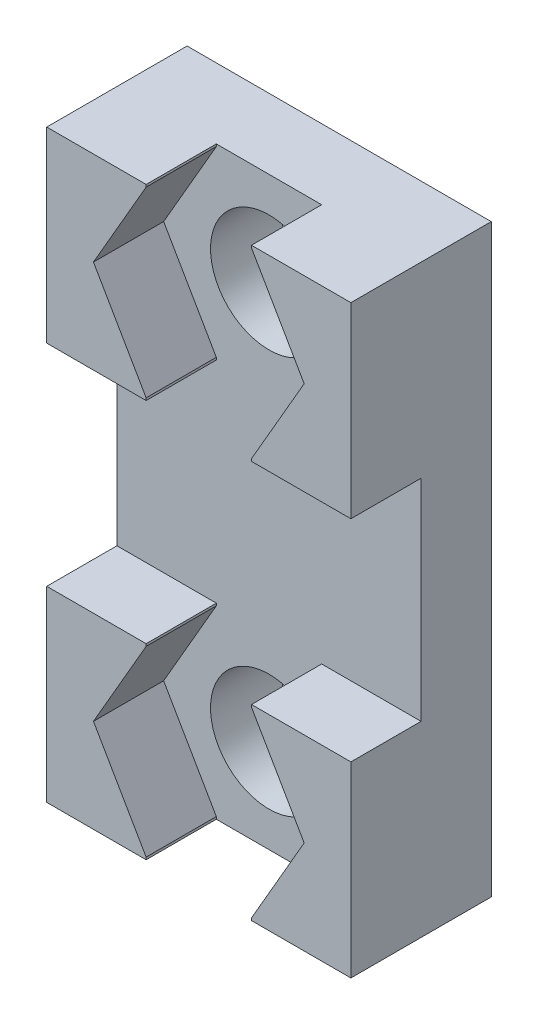
ISO-10303-21;
HEADER;
FILE_DESCRIPTION(('STEP AP214'),'2;1');
FILE_NAME('part.step','',(''),(''),'','','');
FILE_SCHEMA(('AUTOMOTIVE_DESIGN { 1 0 10303 214 1 1 1 1 }'));
ENDSEC;
DATA;
#1=APPLICATION_CONTEXT('core data for automotive mechanical design processes');
#2=APPLICATION_PROTOCOL_DEFINITION('international standard','automotive_design',2000,#1);
#3=PRODUCT_CONTEXT('',#1,'mechanical');
#4=PRODUCT('Part','Part','',(#3));
#5=PRODUCT_RELATED_PRODUCT_CATEGORY('part','',(#4));
#6=PRODUCT_DEFINITION_FORMATION('','',#4);
#7=PRODUCT_DEFINITION_CONTEXT('part definition',#1,'design');
#8=PRODUCT_DEFINITION('design','',#6,#7);
#9=PRODUCT_DEFINITION_SHAPE('','',#8);
#10=(LENGTH_UNIT() NAMED_UNIT(*) SI_UNIT(.MILLI.,.METRE.));
#11=(NAMED_UNIT(*) PLANE_ANGLE_UNIT() SI_UNIT($,.RADIAN.));
#12=(NAMED_UNIT(*) SI_UNIT($,.STERADIAN.) SOLID_ANGLE_UNIT());
#13=UNCERTAINTY_MEASURE_WITH_UNIT(LENGTH_MEASURE(1.E-05),#10,'distance_accuracy_value','');
#14=(GEOMETRIC_REPRESENTATION_CONTEXT(3) GLOBAL_UNCERTAINTY_ASSIGNED_CONTEXT((#13)) GLOBAL_UNIT_ASSIGNED_CONTEXT((#10,
#11,#12)) REPRESENTATION_CONTEXT('',''));
#15=CARTESIAN_POINT('',(0.,0.,0.));
#16=DIRECTION('',(0.,0.,1.));
#17=DIRECTION('',(1.,0.,0.));
#18=AXIS2_PLACEMENT_3D('',#15,#16,#17);
#19=CARTESIAN_POINT('',(0.,0.,1.5));
#20=DIRECTION('',(0.,0.,1.));
#21=DIRECTION('',(1.,0.,0.));
#22=AXIS2_PLACEMENT_3D('',#19,#20,#21);
#23=PLANE('',#22);
#24=CARTESIAN_POINT('',(-44.25,-13.525,1.5));
#25=DIRECTION('',(0.,0.,1.));
#26=DIRECTION('',(1.,0.,0.));
#27=AXIS2_PLACEMENT_3D('',#24,#25,#26);
#28=CIRCLE('',#27,1.25000000000001);
#29=CARTESIAN_POINT('',(-43.,-13.525,1.5));
#30=VERTEX_POINT('',#29);
#31=EDGE_CURVE('E430',#30,#30,#28,.T.);
#32=ORIENTED_EDGE('',*,*,#31,.F.);
#33=EDGE_LOOP('',(#32));
#34=FACE_BOUND('',#33,.T.);
#35=CARTESIAN_POINT('',(-44.25,-5.02500000000002,1.5));
#36=DIRECTION('',(0.,0.,1.));
#37=DIRECTION('',(1.,0.,0.));
#38=AXIS2_PLACEMENT_3D('',#35,#36,#37);
#39=CIRCLE('',#38,1.25000000000001);
#40=CARTESIAN_POINT('',(-43.,-5.02500000000002,1.5));
#41=VERTEX_POINT('',#40);
#42=EDGE_CURVE('E440',#41,#41,#39,.T.);
#43=ORIENTED_EDGE('',*,*,#42,.F.);
#44=EDGE_LOOP('',(#43));
#45=FACE_BOUND('',#44,.T.);
#46=DIRECTION('',(1.,0.,0.));
#47=VECTOR('',#46,1.);
#48=CARTESIAN_POINT('',(0.,-15.525,1.5));
#49=LINE('',#48,#47);
#50=CARTESIAN_POINT('',(-45.3758330249198,-15.525,1.5));
#51=VERTEX_POINT('',#50);
#52=CARTESIAN_POINT('',(-43.1241669750802,-15.525,1.5));
#53=VERTEX_POINT('',#52);
#54=EDGE_CURVE('E429',#51,#53,#49,.T.);
#55=ORIENTED_EDGE('',*,*,#54,.T.);
#56=DIRECTION('',(0.,-1.,0.));
#57=VECTOR('',#56,1.);
#58=CARTESIAN_POINT('',(-43.1241669750802,0.,1.5));
#59=LINE('',#58,#57);
#60=CARTESIAN_POINT('',(-43.1241669750802,-15.475,1.5));
#61=VERTEX_POINT('',#60);
#62=EDGE_CURVE('E51',#61,#53,#59,.T.);
#63=ORIENTED_EDGE('',*,*,#62,.F.);
#64=DIRECTION('',(0.499999999999999,0.866025403784439,0.));
#65=VECTOR('',#64,1.);
#66=CARTESIAN_POINT('',(-25.6422536695281,14.8045620587307,1.5));
#67=LINE('',#66,#65);
#68=CARTESIAN_POINT('',(-41.9983339501605,-13.525,1.5));
#69=VERTEX_POINT('',#68);
#70=EDGE_CURVE('E228',#61,#69,#67,.T.);
#71=ORIENTED_EDGE('',*,*,#70,.T.);
#72=DIRECTION('',(-0.499999999999999,0.866025403784439,0.));
#73=VECTOR('',#72,1.);
#74=CARTESIAN_POINT('',(-37.3552472557127,-21.5670620587307,1.5));
#75=LINE('',#74,#73);
#76=CARTESIAN_POINT('',(-43.1241669750802,-11.575,1.5));
#77=VERTEX_POINT('',#76);
#78=EDGE_CURVE('E246',#69,#77,#75,.T.);
#79=ORIENTED_EDGE('',*,*,#78,.T.);
#80=DIRECTION('',(0.,1.,0.));
#81=VECTOR('',#80,1.);
#82=CARTESIAN_POINT('',(-43.1241669750802,0.,1.5));
#83=LINE('',#82,#81);
#84=CARTESIAN_POINT('',(-43.1241669750802,-11.525,1.5));
#85=VERTEX_POINT('',#84);
#86=EDGE_CURVE('E58',#77,#85,#83,.T.);
#87=ORIENTED_EDGE('',*,*,#86,.T.);
#88=DIRECTION('',(-1.,0.,0.));
#89=VECTOR('',#88,1.);
#90=CARTESIAN_POINT('',(0.,-11.525,1.5));
#91=LINE('',#90,#89);
#92=CARTESIAN_POINT('',(-41.,-11.525,1.5));
#93=VERTEX_POINT('',#92);
#94=EDGE_CURVE('E262',#93,#85,#91,.T.);
#95=ORIENTED_EDGE('',*,*,#94,.F.);
#96=DIRECTION('',(0.,1.,0.));
#97=VECTOR('',#96,1.);
#98=CARTESIAN_POINT('',(-41.,0.,1.5));
#99=LINE('',#98,#97);
#100=CARTESIAN_POINT('',(-41.,-7.02500000000002,1.5));
#101=VERTEX_POINT('',#100);
#102=EDGE_CURVE('E437',#93,#101,#99,.T.);
#103=ORIENTED_EDGE('',*,*,#102,.T.);
#104=DIRECTION('',(-1.,0.,0.));
#105=VECTOR('',#104,1.);
#106=CARTESIAN_POINT('',(0.,-7.02500000000002,1.5));
#107=LINE('',#106,#105);
#108=CARTESIAN_POINT('',(-43.1241669750802,-7.02500000000002,1.5));
#109=VERTEX_POINT('',#108);
#110=EDGE_CURVE('E329',#101,#109,#107,.T.);
#111=ORIENTED_EDGE('',*,*,#110,.T.);
#112=DIRECTION('',(0.,-1.,0.));
#113=VECTOR('',#112,1.);
#114=CARTESIAN_POINT('',(-43.1241669750802,0.,1.5));
#115=LINE('',#114,#113);
#116=CARTESIAN_POINT('',(-43.1241669750802,-6.97500000000002,1.5));
#117=VERTEX_POINT('',#116);
#118=EDGE_CURVE('E352',#117,#109,#115,.T.);
#119=ORIENTED_EDGE('',*,*,#118,.F.);
#120=DIRECTION('',(-0.499999999999999,-0.866025403784439,0.));
#121=VECTOR('',#120,1.);
#122=CARTESIAN_POINT('',(-29.322861635612,16.9295620587307,1.5));
#123=LINE('',#122,#121);
#124=CARTESIAN_POINT('',(-41.9983339501605,-5.02500000000002,1.5));
#125=VERTEX_POINT('',#124);
#126=EDGE_CURVE('E349',#125,#117,#123,.T.);
#127=ORIENTED_EDGE('',*,*,#126,.F.);
#128=DIRECTION('',(0.499999999999999,-0.866025403784439,0.));
#129=VECTOR('',#128,1.);
#130=CARTESIAN_POINT('',(-33.6746392896288,-19.4420620587307,1.5));
#131=LINE('',#130,#129);
#132=CARTESIAN_POINT('',(-43.1241669750802,-3.07500000000002,1.5));
#133=VERTEX_POINT('',#132);
#134=EDGE_CURVE('E346',#133,#125,#131,.T.);
#135=ORIENTED_EDGE('',*,*,#134,.F.);
#136=DIRECTION('',(0.,1.,0.));
#137=VECTOR('',#136,1.);
#138=CARTESIAN_POINT('',(-43.1241669750802,0.,1.5));
#139=LINE('',#138,#137);
#140=CARTESIAN_POINT('',(-43.1241669750802,-3.02500000000002,1.5));
#141=VERTEX_POINT('',#140);
#142=EDGE_CURVE('E324',#133,#141,#139,.T.);
#143=ORIENTED_EDGE('',*,*,#142,.T.);
#144=DIRECTION('',(-1.,0.,0.));
#145=VECTOR('',#144,1.);
#146=CARTESIAN_POINT('',(0.,-3.02500000000002,1.5));
#147=LINE('',#146,#145);
#148=CARTESIAN_POINT('',(-45.3758330249198,-3.02500000000002,1.5));
#149=VERTEX_POINT('',#148);
#150=EDGE_CURVE('E37',#141,#149,#147,.T.);
#151=ORIENTED_EDGE('',*,*,#150,.T.);
#152=DIRECTION('',(0.,1.,0.));
#153=VECTOR('',#152,1.);
#154=CARTESIAN_POINT('',(-45.3758330249198,0.,1.5));
#155=LINE('',#154,#153);
#156=CARTESIAN_POINT('',(-45.3758330249198,-3.07500000000002,1.5));
#157=VERTEX_POINT('',#156);
#158=EDGE_CURVE('E378',#157,#149,#155,.T.);
#159=ORIENTED_EDGE('',*,*,#158,.F.);
#160=DIRECTION('',(0.5,0.866025403784439,0.));
#161=VECTOR('',#160,1.);
#162=CARTESIAN_POINT('',(-32.7003607103712,18.8795620587307,1.5));
#163=LINE('',#162,#161);
#164=CARTESIAN_POINT('',(-46.5016660498395,-5.02500000000003,1.5));
#165=VERTEX_POINT('',#164);
#166=EDGE_CURVE('E398',#165,#157,#163,.T.);
#167=ORIENTED_EDGE('',*,*,#166,.F.);
#168=DIRECTION('',(-0.499999999999998,0.86602540378444,0.));
#169=VECTOR('',#168,1.);
#170=CARTESIAN_POINT('',(-37.0521383643881,-21.3920620587307,1.5));
#171=LINE('',#170,#169);
#172=CARTESIAN_POINT('',(-45.3758330249198,-6.97500000000002,1.5));
#173=VERTEX_POINT('',#172);
#174=EDGE_CURVE('E395',#173,#165,#171,.T.);
#175=ORIENTED_EDGE('',*,*,#174,.F.);
#176=DIRECTION('',(0.,1.,0.));
#177=VECTOR('',#176,1.);
#178=CARTESIAN_POINT('',(-45.3758330249198,0.,1.5));
#179=LINE('',#178,#177);
#180=CARTESIAN_POINT('',(-45.3758330249198,-7.02500000000002,1.5));
#181=VERTEX_POINT('',#180);
#182=EDGE_CURVE('E392',#181,#173,#179,.T.);
#183=ORIENTED_EDGE('',*,*,#182,.F.);
#184=DIRECTION('',(-1.,0.,0.));
#185=VECTOR('',#184,1.);
#186=CARTESIAN_POINT('',(0.,-7.02500000000002,1.5));
#187=LINE('',#186,#185);
#188=CARTESIAN_POINT('',(-47.5,-7.02500000000002,1.5));
#189=VERTEX_POINT('',#188);
#190=EDGE_CURVE('E373',#181,#189,#187,.T.);
#191=ORIENTED_EDGE('',*,*,#190,.T.);
#192=DIRECTION('',(0.,-1.,0.));
#193=VECTOR('',#192,1.);
#194=CARTESIAN_POINT('',(-47.5,0.,1.5));
#195=LINE('',#194,#193);
#196=CARTESIAN_POINT('',(-47.5,-11.525,1.5));
#197=VERTEX_POINT('',#196);
#198=EDGE_CURVE('E427',#189,#197,#195,.T.);
#199=ORIENTED_EDGE('',*,*,#198,.T.);
#200=DIRECTION('',(-1.,0.,0.));
#201=VECTOR('',#200,1.);
#202=CARTESIAN_POINT('',(0.,-11.525,1.5));
#203=LINE('',#202,#201);
#204=CARTESIAN_POINT('',(-45.3758330249198,-11.525,1.5));
#205=VERTEX_POINT('',#204);
#206=EDGE_CURVE('E280',#205,#197,#203,.T.);
#207=ORIENTED_EDGE('',*,*,#206,.F.);
#208=DIRECTION('',(0.,-1.,0.));
#209=VECTOR('',#208,1.);
#210=CARTESIAN_POINT('',(-45.3758330249198,0.,1.5));
#211=LINE('',#210,#209);
#212=CARTESIAN_POINT('',(-45.3758330249198,-11.575,1.5));
#213=VERTEX_POINT('',#212);
#214=EDGE_CURVE('E303',#205,#213,#211,.T.);
#215=ORIENTED_EDGE('',*,*,#214,.T.);
#216=DIRECTION('',(-0.499999999999998,-0.86602540378444,0.));
#217=VECTOR('',#216,1.);
#218=CARTESIAN_POINT('',(-29.0197527442875,16.7545620587307,1.5));
#219=LINE('',#218,#217);
#220=CARTESIAN_POINT('',(-46.5016660498395,-13.525,1.5));
#221=VERTEX_POINT('',#220);
#222=EDGE_CURVE('E301',#213,#221,#219,.T.);
#223=ORIENTED_EDGE('',*,*,#222,.T.);
#224=DIRECTION('',(0.5,-0.866025403784439,0.));
#225=VECTOR('',#224,1.);
#226=CARTESIAN_POINT('',(-40.7327463304719,-23.5170620587307,1.5));
#227=LINE('',#226,#225);
#228=CARTESIAN_POINT('',(-45.3758330249198,-15.475,1.5));
#229=VERTEX_POINT('',#228);
#230=EDGE_CURVE('E299',#221,#229,#227,.T.);
#231=ORIENTED_EDGE('',*,*,#230,.T.);
#232=DIRECTION('',(0.,-1.,0.));
#233=VECTOR('',#232,1.);
#234=CARTESIAN_POINT('',(-45.3758330249198,0.,1.5));
#235=LINE('',#234,#233);
#236=EDGE_CURVE('E230',#229,#51,#235,.T.);
#237=ORIENTED_EDGE('',*,*,#236,.T.);
#238=EDGE_LOOP('',(#55,#63,#71,#79,#87,#95,#103,#111,#119,#127,#135,#143,#151,#159,#167,#175,
#183,#191,#199,#207,#215,#223,#231,#237));
#239=FACE_BOUND('',#238,.T.);
#240=ADVANCED_FACE('F33',(#34,#45,#239),#23,.T.);
#241=CARTESIAN_POINT('',(-47.5,0.,1.5));
#242=DIRECTION('',(1.,0.,0.));
#243=DIRECTION('',(0.,1.,0.));
#244=AXIS2_PLACEMENT_3D('',#241,#242,#243);
#245=PLANE('',#244);
#246=DIRECTION('',(0.,-1.,0.));
#247=VECTOR('',#246,1.);
#248=CARTESIAN_POINT('',(-47.5,0.,0.));
#249=LINE('',#248,#247);
#250=CARTESIAN_POINT('',(-47.5,-3.02500000000002,0.));
#251=VERTEX_POINT('',#250);
#252=CARTESIAN_POINT('',(-47.5,-15.525,0.));
#253=VERTEX_POINT('',#252);
#254=EDGE_CURVE('E447',#251,#253,#249,.T.);
#255=ORIENTED_EDGE('',*,*,#254,.T.);
#256=DIRECTION('',(0.,0.,-1.));
#257=VECTOR('',#256,1.);
#258=CARTESIAN_POINT('',(-47.5,-15.525,1.5));
#259=LINE('',#258,#257);
#260=CARTESIAN_POINT('',(-47.5,-15.525,3.));
#261=VERTEX_POINT('',#260);
#262=EDGE_CURVE('E11',#261,#253,#259,.T.);
#263=ORIENTED_EDGE('',*,*,#262,.F.);
#264=DIRECTION('',(0.,-1.,0.));
#265=VECTOR('',#264,1.);
#266=CARTESIAN_POINT('',(-47.5,0.,3.));
#267=LINE('',#266,#265);
#268=CARTESIAN_POINT('',(-47.5,-11.525,3.));
#269=VERTEX_POINT('',#268);
#270=EDGE_CURVE('E291',#269,#261,#267,.T.);
#271=ORIENTED_EDGE('',*,*,#270,.F.);
#272=DIRECTION('',(0.,0.,-1.));
#273=VECTOR('',#272,1.);
#274=CARTESIAN_POINT('',(-47.5,-11.525,3.));
#275=LINE('',#274,#273);
#276=EDGE_CURVE('E309',#269,#197,#275,.T.);
#277=ORIENTED_EDGE('',*,*,#276,.T.);
#278=ORIENTED_EDGE('',*,*,#198,.F.);
#279=DIRECTION('',(0.,0.,-1.));
#280=VECTOR('',#279,1.);
#281=CARTESIAN_POINT('',(-47.5,-7.02500000000002,3.));
#282=LINE('',#281,#280);
#283=CARTESIAN_POINT('',(-47.5,-7.02500000000002,3.));
#284=VERTEX_POINT('',#283);
#285=EDGE_CURVE('E391',#284,#189,#282,.T.);
#286=ORIENTED_EDGE('',*,*,#285,.F.);
#287=DIRECTION('',(0.,-1.,0.));
#288=VECTOR('',#287,1.);
#289=CARTESIAN_POINT('',(-47.5,0.,3.));
#290=LINE('',#289,#288);
#291=CARTESIAN_POINT('',(-47.5,-3.02500000000002,3.));
#292=VERTEX_POINT('',#291);
#293=EDGE_CURVE('E389',#292,#284,#290,.T.);
#294=ORIENTED_EDGE('',*,*,#293,.F.);
#295=DIRECTION('',(0.,0.,-1.));
#296=VECTOR('',#295,1.);
#297=CARTESIAN_POINT('',(-47.5,-3.02500000000002,1.5));
#298=LINE('',#297,#296);
#299=EDGE_CURVE('E443',#292,#251,#298,.T.);
#300=ORIENTED_EDGE('',*,*,#299,.T.);
#301=EDGE_LOOP('',(#255,#263,#271,#277,#278,#286,#294,#300));
#302=FACE_BOUND('',#301,.T.);
#303=ADVANCED_FACE('F480',(#302),#245,.F.);
#304=CARTESIAN_POINT('',(0.,-15.525,1.5));
#305=DIRECTION('',(0.,1.,0.));
#306=DIRECTION('',(0.,0.,1.));
#307=AXIS2_PLACEMENT_3D('',#304,#305,#306);
#308=PLANE('',#307);
#309=DIRECTION('',(1.,0.,0.));
#310=VECTOR('',#309,1.);
#311=CARTESIAN_POINT('',(0.,-15.525,0.));
#312=LINE('',#311,#310);
#313=CARTESIAN_POINT('',(-41.,-15.525,0.));
#314=VERTEX_POINT('',#313);
#315=EDGE_CURVE('E451',#253,#314,#312,.T.);
#316=ORIENTED_EDGE('',*,*,#315,.T.);
#317=DIRECTION('',(0.,0.,-1.));
#318=VECTOR('',#317,1.);
#319=CARTESIAN_POINT('',(-41.,-15.525,1.5));
#320=LINE('',#319,#318);
#321=CARTESIAN_POINT('',(-41.,-15.525,3.));
#322=VERTEX_POINT('',#321);
#323=EDGE_CURVE('E43',#322,#314,#320,.T.);
#324=ORIENTED_EDGE('',*,*,#323,.F.);
#325=DIRECTION('',(1.,0.,0.));
#326=VECTOR('',#325,1.);
#327=CARTESIAN_POINT('',(0.,-15.525,3.));
#328=LINE('',#327,#326);
#329=CARTESIAN_POINT('',(-43.1241669750802,-15.525,3.));
#330=VERTEX_POINT('',#329);
#331=EDGE_CURVE('E240',#330,#322,#328,.T.);
#332=ORIENTED_EDGE('',*,*,#331,.F.);
#333=DIRECTION('',(0.,0.,-1.));
#334=VECTOR('',#333,1.);
#335=CARTESIAN_POINT('',(-43.1241669750802,-15.525,3.));
#336=LINE('',#335,#334);
#337=EDGE_CURVE('E231',#330,#53,#336,.T.);
#338=ORIENTED_EDGE('',*,*,#337,.T.);
#339=ORIENTED_EDGE('',*,*,#54,.F.);
#340=DIRECTION('',(0.,0.,-1.));
#341=VECTOR('',#340,1.);
#342=CARTESIAN_POINT('',(-45.3758330249198,-15.525,3.));
#343=LINE('',#342,#341);
#344=CARTESIAN_POINT('',(-45.3758330249198,-15.525,3.));
#345=VERTEX_POINT('',#344);
#346=EDGE_CURVE('E296',#345,#51,#343,.T.);
#347=ORIENTED_EDGE('',*,*,#346,.F.);
#348=DIRECTION('',(1.,0.,0.));
#349=VECTOR('',#348,1.);
#350=CARTESIAN_POINT('',(0.,-15.525,3.));
#351=LINE('',#350,#349);
#352=EDGE_CURVE('E294',#261,#345,#351,.T.);
#353=ORIENTED_EDGE('',*,*,#352,.F.);
#354=ORIENTED_EDGE('',*,*,#262,.T.);
#355=EDGE_LOOP('',(#316,#324,#332,#338,#339,#347,#353,#354));
#356=FACE_BOUND('',#355,.T.);
#357=ADVANCED_FACE('F528',(#356),#308,.F.);
#358=CARTESIAN_POINT('',(-41.,0.,1.5));
#359=DIRECTION('',(-1.,0.,0.));
#360=DIRECTION('',(0.,0.,1.));
#361=AXIS2_PLACEMENT_3D('',#358,#359,#360);
#362=PLANE('',#361);
#363=DIRECTION('',(0.,1.,0.));
#364=VECTOR('',#363,1.);
#365=CARTESIAN_POINT('',(-41.,0.,0.));
#366=LINE('',#365,#364);
#367=CARTESIAN_POINT('',(-41.,-3.02500000000002,0.));
#368=VERTEX_POINT('',#367);
#369=EDGE_CURVE('E453',#314,#368,#366,.T.);
#370=ORIENTED_EDGE('',*,*,#369,.T.);
#371=DIRECTION('',(0.,0.,-1.));
#372=VECTOR('',#371,1.);
#373=CARTESIAN_POINT('',(-41.,-3.02500000000002,1.5));
#374=LINE('',#373,#372);
#375=CARTESIAN_POINT('',(-41.,-3.02500000000002,3.));
#376=VERTEX_POINT('',#375);
#377=EDGE_CURVE('E462',#376,#368,#374,.T.);
#378=ORIENTED_EDGE('',*,*,#377,.F.);
#379=DIRECTION('',(0.,1.,0.));
#380=VECTOR('',#379,1.);
#381=CARTESIAN_POINT('',(-41.,0.,3.));
#382=LINE('',#381,#380);
#383=CARTESIAN_POINT('',(-41.,-7.02500000000002,3.));
#384=VERTEX_POINT('',#383);
#385=EDGE_CURVE('E338',#384,#376,#382,.T.);
#386=ORIENTED_EDGE('',*,*,#385,.F.);
#387=DIRECTION('',(0.,0.,-1.));
#388=VECTOR('',#387,1.);
#389=CARTESIAN_POINT('',(-41.,-7.02500000000002,3.));
#390=LINE('',#389,#388);
#391=EDGE_CURVE('E358',#384,#101,#390,.T.);
#392=ORIENTED_EDGE('',*,*,#391,.T.);
#393=ORIENTED_EDGE('',*,*,#102,.F.);
#394=DIRECTION('',(0.,0.,-1.));
#395=VECTOR('',#394,1.);
#396=CARTESIAN_POINT('',(-41.,-11.525,3.));
#397=LINE('',#396,#395);
#398=CARTESIAN_POINT('',(-41.,-11.525,3.));
#399=VERTEX_POINT('',#398);
#400=EDGE_CURVE('E272',#399,#93,#397,.T.);
#401=ORIENTED_EDGE('',*,*,#400,.F.);
#402=DIRECTION('',(0.,1.,0.));
#403=VECTOR('',#402,1.);
#404=CARTESIAN_POINT('',(-41.,0.,3.));
#405=LINE('',#404,#403);
#406=EDGE_CURVE('E251',#322,#399,#405,.T.);
#407=ORIENTED_EDGE('',*,*,#406,.F.);
#408=ORIENTED_EDGE('',*,*,#323,.T.);
#409=EDGE_LOOP('',(#370,#378,#386,#392,#393,#401,#407,#408));
#410=FACE_BOUND('',#409,.T.);
#411=ADVANCED_FACE('F468',(#410),#362,.F.);
#412=CARTESIAN_POINT('',(0.,-3.02500000000002,1.5));
#413=DIRECTION('',(0.,-1.,0.));
#414=DIRECTION('',(0.,0.,-1.));
#415=AXIS2_PLACEMENT_3D('',#412,#413,#414);
#416=PLANE('',#415);
#417=DIRECTION('',(-1.,0.,0.));
#418=VECTOR('',#417,1.);
#419=CARTESIAN_POINT('',(0.,-3.02500000000002,0.));
#420=LINE('',#419,#418);
#421=EDGE_CURVE('E455',#368,#251,#420,.T.);
#422=ORIENTED_EDGE('',*,*,#421,.T.);
#423=ORIENTED_EDGE('',*,*,#299,.F.);
#424=DIRECTION('',(-1.,0.,0.));
#425=VECTOR('',#424,1.);
#426=CARTESIAN_POINT('',(0.,-3.02500000000002,3.));
#427=LINE('',#426,#425);
#428=CARTESIAN_POINT('',(-45.3758330249198,-3.02500000000002,3.));
#429=VERTEX_POINT('',#428);
#430=EDGE_CURVE('E386',#429,#292,#427,.T.);
#431=ORIENTED_EDGE('',*,*,#430,.F.);
#432=DIRECTION('',(0.,0.,-1.));
#433=VECTOR('',#432,1.);
#434=CARTESIAN_POINT('',(-45.3758330249198,-3.02500000000002,3.));
#435=LINE('',#434,#433);
#436=EDGE_CURVE('E411',#429,#149,#435,.T.);
#437=ORIENTED_EDGE('',*,*,#436,.T.);
#438=ORIENTED_EDGE('',*,*,#150,.F.);
#439=DIRECTION('',(0.,0.,-1.));
#440=VECTOR('',#439,1.);
#441=CARTESIAN_POINT('',(-43.1241669750802,-3.02500000000002,3.));
#442=LINE('',#441,#440);
#443=CARTESIAN_POINT('',(-43.1241669750802,-3.02500000000002,3.));
#444=VERTEX_POINT('',#443);
#445=EDGE_CURVE('E343',#444,#141,#442,.T.);
#446=ORIENTED_EDGE('',*,*,#445,.F.);
#447=DIRECTION('',(-1.,0.,0.));
#448=VECTOR('',#447,1.);
#449=CARTESIAN_POINT('',(0.,-3.02500000000002,3.));
#450=LINE('',#449,#448);
#451=EDGE_CURVE('E341',#376,#444,#450,.T.);
#452=ORIENTED_EDGE('',*,*,#451,.F.);
#453=ORIENTED_EDGE('',*,*,#377,.T.);
#454=EDGE_LOOP('',(#422,#423,#431,#437,#438,#446,#452,#453));
#455=FACE_BOUND('',#454,.T.);
#456=ADVANCED_FACE('F476',(#455),#416,.F.);
#457=CARTESIAN_POINT('',(-44.25,-13.525,1.5));
#458=DIRECTION('',(0.,0.,-1.));
#459=DIRECTION('',(-1.,0.,0.));
#460=AXIS2_PLACEMENT_3D('',#457,#458,#459);
#461=CYLINDRICAL_SURFACE('',#460,1.25000000000001);
#462=ORIENTED_EDGE('',*,*,#31,.T.);
#463=EDGE_LOOP('',(#462));
#464=FACE_BOUND('',#463,.T.);
#465=CARTESIAN_POINT('',(-44.25,-13.525,0.));
#466=DIRECTION('',(0.,0.,1.));
#467=DIRECTION('',(1.,0.,0.));
#468=AXIS2_PLACEMENT_3D('',#465,#466,#467);
#469=CIRCLE('',#468,1.25000000000001);
#470=CARTESIAN_POINT('',(-43.,-13.525,0.));
#471=VERTEX_POINT('',#470);
#472=EDGE_CURVE('E444',#471,#471,#469,.T.);
#473=ORIENTED_EDGE('',*,*,#472,.F.);
#474=EDGE_LOOP('',(#473));
#475=FACE_BOUND('',#474,.T.);
#476=ADVANCED_FACE('F35',(#464,#475),#461,.F.);
#477=CARTESIAN_POINT('',(-44.25,-5.02500000000002,1.5));
#478=DIRECTION('',(0.,0.,-1.));
#479=DIRECTION('',(-1.,0.,0.));
#480=AXIS2_PLACEMENT_3D('',#477,#478,#479);
#481=CYLINDRICAL_SURFACE('',#480,1.25000000000001);
#482=ORIENTED_EDGE('',*,*,#42,.T.);
#483=EDGE_LOOP('',(#482));
#484=FACE_BOUND('',#483,.T.);
#485=CARTESIAN_POINT('',(-44.25,-5.02500000000002,0.));
#486=DIRECTION('',(0.,0.,1.));
#487=DIRECTION('',(1.,0.,0.));
#488=AXIS2_PLACEMENT_3D('',#485,#486,#487);
#489=CIRCLE('',#488,1.25000000000001);
#490=CARTESIAN_POINT('',(-43.,-5.02500000000002,0.));
#491=VERTEX_POINT('',#490);
#492=EDGE_CURVE('E457',#491,#491,#489,.T.);
#493=ORIENTED_EDGE('',*,*,#492,.F.);
#494=EDGE_LOOP('',(#493));
#495=FACE_BOUND('',#494,.T.);
#496=ADVANCED_FACE('F559',(#484,#495),#481,.F.);
#497=CARTESIAN_POINT('',(0.,0.,0.));
#498=DIRECTION('',(0.,0.,1.));
#499=DIRECTION('',(1.,0.,0.));
#500=AXIS2_PLACEMENT_3D('',#497,#498,#499);
#501=PLANE('',#500);
#502=ORIENTED_EDGE('',*,*,#472,.T.);
#503=EDGE_LOOP('',(#502));
#504=FACE_BOUND('',#503,.T.);
#505=ORIENTED_EDGE('',*,*,#254,.F.);
#506=ORIENTED_EDGE('',*,*,#421,.F.);
#507=ORIENTED_EDGE('',*,*,#369,.F.);
#508=ORIENTED_EDGE('',*,*,#315,.F.);
#509=EDGE_LOOP('',(#505,#506,#507,#508));
#510=FACE_BOUND('',#509,.T.);
#511=ORIENTED_EDGE('',*,*,#492,.T.);
#512=EDGE_LOOP('',(#511));
#513=FACE_BOUND('',#512,.T.);
#514=ADVANCED_FACE('F474',(#504,#510,#513),#501,.F.);
#515=CARTESIAN_POINT('',(0.,-7.02500000000002,3.));
#516=DIRECTION('',(0.,-1.,0.));
#517=DIRECTION('',(0.,0.,-1.));
#518=AXIS2_PLACEMENT_3D('',#515,#516,#517);
#519=PLANE('',#518);
#520=ORIENTED_EDGE('',*,*,#190,.F.);
#521=DIRECTION('',(0.,0.,-1.));
#522=VECTOR('',#521,1.);
#523=CARTESIAN_POINT('',(-45.3758330249198,-7.02500000000002,3.));
#524=LINE('',#523,#522);
#525=CARTESIAN_POINT('',(-45.3758330249198,-7.02500000000002,3.));
#526=VERTEX_POINT('',#525);
#527=EDGE_CURVE('E448',#526,#181,#524,.T.);
#528=ORIENTED_EDGE('',*,*,#527,.F.);
#529=DIRECTION('',(-1.,0.,0.));
#530=VECTOR('',#529,1.);
#531=CARTESIAN_POINT('',(0.,-7.02500000000002,3.));
#532=LINE('',#531,#530);
#533=EDGE_CURVE('E374',#526,#284,#532,.T.);
#534=ORIENTED_EDGE('',*,*,#533,.T.);
#535=ORIENTED_EDGE('',*,*,#285,.T.);
#536=EDGE_LOOP('',(#520,#528,#534,#535));
#537=FACE_BOUND('',#536,.T.);
#538=ADVANCED_FACE('F504',(#537),#519,.T.);
#539=CARTESIAN_POINT('',(-45.3758330249198,0.,3.));
#540=DIRECTION('',(-1.,0.,0.));
#541=DIRECTION('',(0.,0.,1.));
#542=AXIS2_PLACEMENT_3D('',#539,#540,#541);
#543=PLANE('',#542);
#544=ORIENTED_EDGE('',*,*,#182,.T.);
#545=DIRECTION('',(0.,0.,-1.));
#546=VECTOR('',#545,1.);
#547=CARTESIAN_POINT('',(-45.3758330249198,-6.97500000000002,3.));
#548=LINE('',#547,#546);
#549=CARTESIAN_POINT('',(-45.3758330249198,-6.97500000000002,3.));
#550=VERTEX_POINT('',#549);
#551=EDGE_CURVE('E496',#550,#173,#548,.T.);
#552=ORIENTED_EDGE('',*,*,#551,.F.);
#553=DIRECTION('',(0.,1.,0.));
#554=VECTOR('',#553,1.);
#555=CARTESIAN_POINT('',(-45.3758330249198,0.,3.));
#556=LINE('',#555,#554);
#557=EDGE_CURVE('E377',#526,#550,#556,.T.);
#558=ORIENTED_EDGE('',*,*,#557,.F.);
#559=ORIENTED_EDGE('',*,*,#527,.T.);
#560=EDGE_LOOP('',(#544,#552,#558,#559));
#561=FACE_BOUND('',#560,.T.);
#562=ADVANCED_FACE('F502',(#561),#543,.F.);
#563=CARTESIAN_POINT('',(-37.0521383643881,-21.3920620587307,3.));
#564=DIRECTION('',(-0.86602540378444,-0.499999999999998,0.));
#565=DIRECTION('',(0.499999999999998,-0.86602540378444,0.));
#566=AXIS2_PLACEMENT_3D('',#563,#564,#565);
#567=PLANE('',#566);
#568=ORIENTED_EDGE('',*,*,#174,.T.);
#569=DIRECTION('',(0.,0.,-1.));
#570=VECTOR('',#569,1.);
#571=CARTESIAN_POINT('',(-46.5016660498395,-5.02500000000003,3.));
#572=LINE('',#571,#570);
#573=CARTESIAN_POINT('',(-46.5016660498395,-5.02500000000003,3.));
#574=VERTEX_POINT('',#573);
#575=EDGE_CURVE('E418',#574,#165,#572,.T.);
#576=ORIENTED_EDGE('',*,*,#575,.F.);
#577=DIRECTION('',(-0.499999999999998,0.86602540378444,0.));
#578=VECTOR('',#577,1.);
#579=CARTESIAN_POINT('',(-37.0521383643881,-21.3920620587307,3.));
#580=LINE('',#579,#578);
#581=EDGE_CURVE('E380',#550,#574,#580,.T.);
#582=ORIENTED_EDGE('',*,*,#581,.F.);
#583=ORIENTED_EDGE('',*,*,#551,.T.);
#584=EDGE_LOOP('',(#568,#576,#582,#583));
#585=FACE_BOUND('',#584,.T.);
#586=ADVANCED_FACE('F606',(#585),#567,.F.);
#587=CARTESIAN_POINT('',(-32.7003607103712,18.8795620587307,3.));
#588=DIRECTION('',(-0.866025403784439,0.5,0.));
#589=DIRECTION('',(-0.5,-0.866025403784439,0.));
#590=AXIS2_PLACEMENT_3D('',#587,#588,#589);
#591=PLANE('',#590);
#592=ORIENTED_EDGE('',*,*,#166,.T.);
#593=DIRECTION('',(0.,0.,-1.));
#594=VECTOR('',#593,1.);
#595=CARTESIAN_POINT('',(-45.3758330249198,-3.07500000000002,3.));
#596=LINE('',#595,#594);
#597=CARTESIAN_POINT('',(-45.3758330249198,-3.07500000000002,3.));
#598=VERTEX_POINT('',#597);
#599=EDGE_CURVE('E403',#598,#157,#596,.T.);
#600=ORIENTED_EDGE('',*,*,#599,.F.);
#601=DIRECTION('',(0.5,0.866025403784439,0.));
#602=VECTOR('',#601,1.);
#603=CARTESIAN_POINT('',(-32.7003607103712,18.8795620587307,3.));
#604=LINE('',#603,#602);
#605=EDGE_CURVE('E382',#574,#598,#604,.T.);
#606=ORIENTED_EDGE('',*,*,#605,.F.);
#607=ORIENTED_EDGE('',*,*,#575,.T.);
#608=EDGE_LOOP('',(#592,#600,#606,#607));
#609=FACE_BOUND('',#608,.T.);
#610=ADVANCED_FACE('F492',(#609),#591,.F.);
#611=CARTESIAN_POINT('',(-45.3758330249198,0.,3.));
#612=DIRECTION('',(-1.,0.,0.));
#613=DIRECTION('',(0.,0.,1.));
#614=AXIS2_PLACEMENT_3D('',#611,#612,#613);
#615=PLANE('',#614);
#616=ORIENTED_EDGE('',*,*,#158,.T.);
#617=ORIENTED_EDGE('',*,*,#436,.F.);
#618=DIRECTION('',(0.,1.,0.));
#619=VECTOR('',#618,1.);
#620=CARTESIAN_POINT('',(-45.3758330249198,0.,3.));
#621=LINE('',#620,#619);
#622=EDGE_CURVE('E384',#598,#429,#621,.T.);
#623=ORIENTED_EDGE('',*,*,#622,.F.);
#624=ORIENTED_EDGE('',*,*,#599,.T.);
#625=EDGE_LOOP('',(#616,#617,#623,#624));
#626=FACE_BOUND('',#625,.T.);
#627=ADVANCED_FACE('F489',(#626),#615,.F.);
#628=CARTESIAN_POINT('',(0.,0.,3.));
#629=DIRECTION('',(0.,0.,1.));
#630=DIRECTION('',(1.,0.,0.));
#631=AXIS2_PLACEMENT_3D('',#628,#629,#630);
#632=PLANE('',#631);
#633=ORIENTED_EDGE('',*,*,#533,.F.);
#634=ORIENTED_EDGE('',*,*,#557,.T.);
#635=ORIENTED_EDGE('',*,*,#581,.T.);
#636=ORIENTED_EDGE('',*,*,#605,.T.);
#637=ORIENTED_EDGE('',*,*,#622,.T.);
#638=ORIENTED_EDGE('',*,*,#430,.T.);
#639=ORIENTED_EDGE('',*,*,#293,.T.);
#640=EDGE_LOOP('',(#633,#634,#635,#636,#637,#638,#639));
#641=FACE_BOUND('',#640,.T.);
#642=ADVANCED_FACE('F484',(#641),#632,.T.);
#643=CARTESIAN_POINT('',(-43.1241669750802,0.,3.));
#644=DIRECTION('',(-1.,0.,0.));
#645=DIRECTION('',(0.,0.,1.));
#646=AXIS2_PLACEMENT_3D('',#643,#644,#645);
#647=PLANE('',#646);
#648=ORIENTED_EDGE('',*,*,#142,.F.);
#649=DIRECTION('',(0.,0.,-1.));
#650=VECTOR('',#649,1.);
#651=CARTESIAN_POINT('',(-43.1241669750802,-3.07500000000002,3.));
#652=LINE('',#651,#650);
#653=CARTESIAN_POINT('',(-43.1241669750802,-3.07500000000002,3.));
#654=VERTEX_POINT('',#653);
#655=EDGE_CURVE('E370',#654,#133,#652,.T.);
#656=ORIENTED_EDGE('',*,*,#655,.F.);
#657=DIRECTION('',(0.,1.,0.));
#658=VECTOR('',#657,1.);
#659=CARTESIAN_POINT('',(-43.1241669750802,0.,3.));
#660=LINE('',#659,#658);
#661=EDGE_CURVE('E325',#654,#444,#660,.T.);
#662=ORIENTED_EDGE('',*,*,#661,.T.);
#663=ORIENTED_EDGE('',*,*,#445,.T.);
#664=EDGE_LOOP('',(#648,#656,#662,#663));
#665=FACE_BOUND('',#664,.T.);
#666=ADVANCED_FACE('F630',(#665),#647,.T.);
#667=CARTESIAN_POINT('',(-33.6746392896288,-19.4420620587307,3.));
#668=DIRECTION('',(0.866025403784439,0.499999999999999,0.));
#669=DIRECTION('',(-0.499999999999999,0.866025403784439,0.));
#670=AXIS2_PLACEMENT_3D('',#667,#668,#669);
#671=PLANE('',#670);
#672=ORIENTED_EDGE('',*,*,#134,.T.);
#673=DIRECTION('',(0.,0.,-1.));
#674=VECTOR('',#673,1.);
#675=CARTESIAN_POINT('',(-41.9983339501605,-5.02500000000002,3.));
#676=LINE('',#675,#674);
#677=CARTESIAN_POINT('',(-41.9983339501605,-5.02500000000002,3.));
#678=VERTEX_POINT('',#677);
#679=EDGE_CURVE('E367',#678,#125,#676,.T.);
#680=ORIENTED_EDGE('',*,*,#679,.F.);
#681=DIRECTION('',(0.499999999999999,-0.866025403784439,0.));
#682=VECTOR('',#681,1.);
#683=CARTESIAN_POINT('',(-33.6746392896288,-19.4420620587307,3.));
#684=LINE('',#683,#682);
#685=EDGE_CURVE('E328',#654,#678,#684,.T.);
#686=ORIENTED_EDGE('',*,*,#685,.F.);
#687=ORIENTED_EDGE('',*,*,#655,.T.);
#688=EDGE_LOOP('',(#672,#680,#686,#687));
#689=FACE_BOUND('',#688,.T.);
#690=ADVANCED_FACE('F637',(#689),#671,.F.);
#691=CARTESIAN_POINT('',(-29.322861635612,16.9295620587307,3.));
#692=DIRECTION('',(0.866025403784439,-0.499999999999999,0.));
#693=DIRECTION('',(0.499999999999999,0.866025403784439,0.));
#694=AXIS2_PLACEMENT_3D('',#691,#692,#693);
#695=PLANE('',#694);
#696=ORIENTED_EDGE('',*,*,#126,.T.);
#697=DIRECTION('',(0.,0.,-1.));
#698=VECTOR('',#697,1.);
#699=CARTESIAN_POINT('',(-43.1241669750802,-6.97500000000002,3.));
#700=LINE('',#699,#698);
#701=CARTESIAN_POINT('',(-43.1241669750802,-6.97500000000002,3.));
#702=VERTEX_POINT('',#701);
#703=EDGE_CURVE('E364',#702,#117,#700,.T.);
#704=ORIENTED_EDGE('',*,*,#703,.F.);
#705=DIRECTION('',(-0.499999999999999,-0.866025403784439,0.));
#706=VECTOR('',#705,1.);
#707=CARTESIAN_POINT('',(-29.322861635612,16.9295620587307,3.));
#708=LINE('',#707,#706);
#709=EDGE_CURVE('E331',#678,#702,#708,.T.);
#710=ORIENTED_EDGE('',*,*,#709,.F.);
#711=ORIENTED_EDGE('',*,*,#679,.T.);
#712=EDGE_LOOP('',(#696,#704,#710,#711));
#713=FACE_BOUND('',#712,.T.);
#714=ADVANCED_FACE('F645',(#713),#695,.F.);
#715=CARTESIAN_POINT('',(-43.1241669750802,0.,3.));
#716=DIRECTION('',(1.,0.,0.));
#717=DIRECTION('',(0.,0.,-1.));
#718=AXIS2_PLACEMENT_3D('',#715,#716,#717);
#719=PLANE('',#718);
#720=ORIENTED_EDGE('',*,*,#118,.T.);
#721=DIRECTION('',(0.,0.,-1.));
#722=VECTOR('',#721,1.);
#723=CARTESIAN_POINT('',(-43.1241669750802,-7.02500000000002,3.));
#724=LINE('',#723,#722);
#725=CARTESIAN_POINT('',(-43.1241669750802,-7.02500000000002,3.));
#726=VERTEX_POINT('',#725);
#727=EDGE_CURVE('E361',#726,#109,#724,.T.);
#728=ORIENTED_EDGE('',*,*,#727,.F.);
#729=DIRECTION('',(0.,-1.,0.));
#730=VECTOR('',#729,1.);
#731=CARTESIAN_POINT('',(-43.1241669750802,0.,3.));
#732=LINE('',#731,#730);
#733=EDGE_CURVE('E333',#702,#726,#732,.T.);
#734=ORIENTED_EDGE('',*,*,#733,.F.);
#735=ORIENTED_EDGE('',*,*,#703,.T.);
#736=EDGE_LOOP('',(#720,#728,#734,#735));
#737=FACE_BOUND('',#736,.T.);
#738=ADVANCED_FACE('F653',(#737),#719,.F.);
#739=CARTESIAN_POINT('',(0.,-7.02500000000002,3.));
#740=DIRECTION('',(0.,-1.,0.));
#741=DIRECTION('',(0.,0.,-1.));
#742=AXIS2_PLACEMENT_3D('',#739,#740,#741);
#743=PLANE('',#742);
#744=ORIENTED_EDGE('',*,*,#110,.F.);
#745=ORIENTED_EDGE('',*,*,#391,.F.);
#746=DIRECTION('',(-1.,0.,0.));
#747=VECTOR('',#746,1.);
#748=CARTESIAN_POINT('',(0.,-7.02500000000002,3.));
#749=LINE('',#748,#747);
#750=EDGE_CURVE('E335',#384,#726,#749,.T.);
#751=ORIENTED_EDGE('',*,*,#750,.T.);
#752=ORIENTED_EDGE('',*,*,#727,.T.);
#753=EDGE_LOOP('',(#744,#745,#751,#752));
#754=FACE_BOUND('',#753,.T.);
#755=ADVANCED_FACE('F661',(#754),#743,.T.);
#756=CARTESIAN_POINT('',(0.,0.,3.));
#757=DIRECTION('',(0.,0.,1.));
#758=DIRECTION('',(1.,0.,0.));
#759=AXIS2_PLACEMENT_3D('',#756,#757,#758);
#760=PLANE('',#759);
#761=ORIENTED_EDGE('',*,*,#661,.F.);
#762=ORIENTED_EDGE('',*,*,#685,.T.);
#763=ORIENTED_EDGE('',*,*,#709,.T.);
#764=ORIENTED_EDGE('',*,*,#733,.T.);
#765=ORIENTED_EDGE('',*,*,#750,.F.);
#766=ORIENTED_EDGE('',*,*,#385,.T.);
#767=ORIENTED_EDGE('',*,*,#451,.T.);
#768=EDGE_LOOP('',(#761,#762,#763,#764,#765,#766,#767));
#769=FACE_BOUND('',#768,.T.);
#770=ADVANCED_FACE('F669',(#769),#760,.T.);
#771=CARTESIAN_POINT('',(-45.3758330249198,0.,3.));
#772=DIRECTION('',(1.,0.,0.));
#773=DIRECTION('',(0.,0.,-1.));
#774=AXIS2_PLACEMENT_3D('',#771,#772,#773);
#775=PLANE('',#774);
#776=ORIENTED_EDGE('',*,*,#236,.F.);
#777=DIRECTION('',(0.,0.,-1.));
#778=VECTOR('',#777,1.);
#779=CARTESIAN_POINT('',(-45.3758330249198,-15.475,3.));
#780=LINE('',#779,#778);
#781=CARTESIAN_POINT('',(-45.3758330249198,-15.475,3.));
#782=VERTEX_POINT('',#781);
#783=EDGE_CURVE('E321',#782,#229,#780,.T.);
#784=ORIENTED_EDGE('',*,*,#783,.F.);
#785=DIRECTION('',(0.,-1.,0.));
#786=VECTOR('',#785,1.);
#787=CARTESIAN_POINT('',(-45.3758330249198,0.,3.));
#788=LINE('',#787,#786);
#789=EDGE_CURVE('E276',#782,#345,#788,.T.);
#790=ORIENTED_EDGE('',*,*,#789,.T.);
#791=ORIENTED_EDGE('',*,*,#346,.T.);
#792=EDGE_LOOP('',(#776,#784,#790,#791));
#793=FACE_BOUND('',#792,.T.);
#794=ADVANCED_FACE('F525',(#793),#775,.T.);
#795=CARTESIAN_POINT('',(-40.7327463304719,-23.5170620587307,3.));
#796=DIRECTION('',(0.866025403784439,0.5,0.));
#797=DIRECTION('',(-0.5,0.866025403784439,0.));
#798=AXIS2_PLACEMENT_3D('',#795,#796,#797);
#799=PLANE('',#798);
#800=ORIENTED_EDGE('',*,*,#230,.F.);
#801=DIRECTION('',(0.,0.,-1.));
#802=VECTOR('',#801,1.);
#803=CARTESIAN_POINT('',(-46.5016660498395,-13.525,3.));
#804=LINE('',#803,#802);
#805=CARTESIAN_POINT('',(-46.5016660498395,-13.525,3.));
#806=VERTEX_POINT('',#805);
#807=EDGE_CURVE('E318',#806,#221,#804,.T.);
#808=ORIENTED_EDGE('',*,*,#807,.F.);
#809=DIRECTION('',(0.5,-0.866025403784439,0.));
#810=VECTOR('',#809,1.);
#811=CARTESIAN_POINT('',(-40.7327463304719,-23.5170620587307,3.));
#812=LINE('',#811,#810);
#813=EDGE_CURVE('E279',#806,#782,#812,.T.);
#814=ORIENTED_EDGE('',*,*,#813,.T.);
#815=ORIENTED_EDGE('',*,*,#783,.T.);
#816=EDGE_LOOP('',(#800,#808,#814,#815));
#817=FACE_BOUND('',#816,.T.);
#818=ADVANCED_FACE('F521',(#817),#799,.T.);
#819=CARTESIAN_POINT('',(-29.0197527442875,16.7545620587307,3.));
#820=DIRECTION('',(0.86602540378444,-0.499999999999998,0.));
#821=DIRECTION('',(0.499999999999998,0.86602540378444,0.));
#822=AXIS2_PLACEMENT_3D('',#819,#820,#821);
#823=PLANE('',#822);
#824=ORIENTED_EDGE('',*,*,#222,.F.);
#825=DIRECTION('',(0.,0.,-1.));
#826=VECTOR('',#825,1.);
#827=CARTESIAN_POINT('',(-45.3758330249198,-11.575,3.));
#828=LINE('',#827,#826);
#829=CARTESIAN_POINT('',(-45.3758330249198,-11.575,3.));
#830=VERTEX_POINT('',#829);
#831=EDGE_CURVE('E315',#830,#213,#828,.T.);
#832=ORIENTED_EDGE('',*,*,#831,.F.);
#833=DIRECTION('',(-0.499999999999998,-0.86602540378444,0.));
#834=VECTOR('',#833,1.);
#835=CARTESIAN_POINT('',(-29.0197527442875,16.7545620587307,3.));
#836=LINE('',#835,#834);
#837=EDGE_CURVE('E283',#830,#806,#836,.T.);
#838=ORIENTED_EDGE('',*,*,#837,.T.);
#839=ORIENTED_EDGE('',*,*,#807,.T.);
#840=EDGE_LOOP('',(#824,#832,#838,#839));
#841=FACE_BOUND('',#840,.T.);
#842=ADVANCED_FACE('F517',(#841),#823,.T.);
#843=CARTESIAN_POINT('',(-45.3758330249198,0.,3.));
#844=DIRECTION('',(1.,0.,0.));
#845=DIRECTION('',(0.,0.,-1.));
#846=AXIS2_PLACEMENT_3D('',#843,#844,#845);
#847=PLANE('',#846);
#848=ORIENTED_EDGE('',*,*,#214,.F.);
#849=DIRECTION('',(0.,0.,-1.));
#850=VECTOR('',#849,1.);
#851=CARTESIAN_POINT('',(-45.3758330249198,-11.525,3.));
#852=LINE('',#851,#850);
#853=CARTESIAN_POINT('',(-45.3758330249198,-11.525,3.));
#854=VERTEX_POINT('',#853);
#855=EDGE_CURVE('E312',#854,#205,#852,.T.);
#856=ORIENTED_EDGE('',*,*,#855,.F.);
#857=DIRECTION('',(0.,-1.,0.));
#858=VECTOR('',#857,1.);
#859=CARTESIAN_POINT('',(-45.3758330249198,0.,3.));
#860=LINE('',#859,#858);
#861=EDGE_CURVE('E286',#854,#830,#860,.T.);
#862=ORIENTED_EDGE('',*,*,#861,.T.);
#863=ORIENTED_EDGE('',*,*,#831,.T.);
#864=EDGE_LOOP('',(#848,#856,#862,#863));
#865=FACE_BOUND('',#864,.T.);
#866=ADVANCED_FACE('F514',(#865),#847,.T.);
#867=CARTESIAN_POINT('',(0.,-11.525,3.));
#868=DIRECTION('',(0.,-1.,0.));
#869=DIRECTION('',(0.,0.,-1.));
#870=AXIS2_PLACEMENT_3D('',#867,#868,#869);
#871=PLANE('',#870);
#872=ORIENTED_EDGE('',*,*,#206,.T.);
#873=ORIENTED_EDGE('',*,*,#276,.F.);
#874=DIRECTION('',(-1.,0.,0.));
#875=VECTOR('',#874,1.);
#876=CARTESIAN_POINT('',(0.,-11.525,3.));
#877=LINE('',#876,#875);
#878=EDGE_CURVE('E289',#854,#269,#877,.T.);
#879=ORIENTED_EDGE('',*,*,#878,.F.);
#880=ORIENTED_EDGE('',*,*,#855,.T.);
#881=EDGE_LOOP('',(#872,#873,#879,#880));
#882=FACE_BOUND('',#881,.T.);
#883=ADVANCED_FACE('F509',(#882),#871,.F.);
#884=CARTESIAN_POINT('',(0.,0.,3.));
#885=DIRECTION('',(0.,0.,1.));
#886=DIRECTION('',(1.,0.,0.));
#887=AXIS2_PLACEMENT_3D('',#884,#885,#886);
#888=PLANE('',#887);
#889=ORIENTED_EDGE('',*,*,#789,.F.);
#890=ORIENTED_EDGE('',*,*,#813,.F.);
#891=ORIENTED_EDGE('',*,*,#837,.F.);
#892=ORIENTED_EDGE('',*,*,#861,.F.);
#893=ORIENTED_EDGE('',*,*,#878,.T.);
#894=ORIENTED_EDGE('',*,*,#270,.T.);
#895=ORIENTED_EDGE('',*,*,#352,.T.);
#896=EDGE_LOOP('',(#889,#890,#891,#892,#893,#894,#895));
#897=FACE_BOUND('',#896,.T.);
#898=ADVANCED_FACE('F708',(#897),#888,.T.);
#899=CARTESIAN_POINT('',(-25.6422536695281,14.8045620587307,3.));
#900=DIRECTION('',(-0.866025403784439,0.499999999999999,0.));
#901=DIRECTION('',(-0.499999999999999,-0.866025403784439,0.));
#902=AXIS2_PLACEMENT_3D('',#899,#900,#901);
#903=PLANE('',#902);
#904=ORIENTED_EDGE('',*,*,#70,.F.);
#905=DIRECTION('',(0.,0.,-1.));
#906=VECTOR('',#905,1.);
#907=CARTESIAN_POINT('',(-43.1241669750802,-15.475,3.));
#908=LINE('',#907,#906);
#909=CARTESIAN_POINT('',(-43.1241669750802,-15.475,3.));
#910=VERTEX_POINT('',#909);
#911=EDGE_CURVE('E221',#910,#61,#908,.T.);
#912=ORIENTED_EDGE('',*,*,#911,.F.);
#913=DIRECTION('',(0.499999999999999,0.866025403784439,0.));
#914=VECTOR('',#913,1.);
#915=CARTESIAN_POINT('',(-25.6422536695281,14.8045620587307,3.));
#916=LINE('',#915,#914);
#917=CARTESIAN_POINT('',(-41.9983339501605,-13.525,3.));
#918=VERTEX_POINT('',#917);
#919=EDGE_CURVE('E226',#910,#918,#916,.T.);
#920=ORIENTED_EDGE('',*,*,#919,.T.);
#921=DIRECTION('',(0.,0.,-1.));
#922=VECTOR('',#921,1.);
#923=CARTESIAN_POINT('',(-41.9983339501605,-13.525,3.));
#924=LINE('',#923,#922);
#925=EDGE_CURVE('E259',#918,#69,#924,.T.);
#926=ORIENTED_EDGE('',*,*,#925,.T.);
#927=EDGE_LOOP('',(#904,#912,#920,#926));
#928=FACE_BOUND('',#927,.T.);
#929=ADVANCED_FACE('F223',(#928),#903,.T.);
#930=CARTESIAN_POINT('',(-43.1241669750802,0.,3.));
#931=DIRECTION('',(1.,0.,0.));
#932=DIRECTION('',(0.,0.,-1.));
#933=AXIS2_PLACEMENT_3D('',#930,#931,#932);
#934=PLANE('',#933);
#935=ORIENTED_EDGE('',*,*,#62,.T.);
#936=ORIENTED_EDGE('',*,*,#337,.F.);
#937=DIRECTION('',(0.,-1.,0.));
#938=VECTOR('',#937,1.);
#939=CARTESIAN_POINT('',(-43.1241669750802,0.,3.));
#940=LINE('',#939,#938);
#941=EDGE_CURVE('E234',#910,#330,#940,.T.);
#942=ORIENTED_EDGE('',*,*,#941,.F.);
#943=ORIENTED_EDGE('',*,*,#911,.T.);
#944=EDGE_LOOP('',(#935,#936,#942,#943));
#945=FACE_BOUND('',#944,.T.);
#946=ADVANCED_FACE('F235',(#945),#934,.F.);
#947=CARTESIAN_POINT('',(0.,-11.525,3.));
#948=DIRECTION('',(0.,-1.,0.));
#949=DIRECTION('',(0.,0.,-1.));
#950=AXIS2_PLACEMENT_3D('',#947,#948,#949);
#951=PLANE('',#950);
#952=ORIENTED_EDGE('',*,*,#94,.T.);
#953=DIRECTION('',(0.,0.,-1.));
#954=VECTOR('',#953,1.);
#955=CARTESIAN_POINT('',(-43.1241669750802,-11.525,3.));
#956=LINE('',#955,#954);
#957=CARTESIAN_POINT('',(-43.1241669750802,-11.525,3.));
#958=VERTEX_POINT('',#957);
#959=EDGE_CURVE('E270',#958,#85,#956,.T.);
#960=ORIENTED_EDGE('',*,*,#959,.F.);
#961=DIRECTION('',(-1.,0.,0.));
#962=VECTOR('',#961,1.);
#963=CARTESIAN_POINT('',(0.,-11.525,3.));
#964=LINE('',#963,#962);
#965=EDGE_CURVE('E253',#399,#958,#964,.T.);
#966=ORIENTED_EDGE('',*,*,#965,.F.);
#967=ORIENTED_EDGE('',*,*,#400,.T.);
#968=EDGE_LOOP('',(#952,#960,#966,#967));
#969=FACE_BOUND('',#968,.T.);
#970=ADVANCED_FACE('F532',(#969),#951,.F.);
#971=CARTESIAN_POINT('',(-43.1241669750802,0.,3.));
#972=DIRECTION('',(-1.,0.,0.));
#973=DIRECTION('',(0.,0.,1.));
#974=AXIS2_PLACEMENT_3D('',#971,#972,#973);
#975=PLANE('',#974);
#976=ORIENTED_EDGE('',*,*,#86,.F.);
#977=DIRECTION('',(0.,0.,-1.));
#978=VECTOR('',#977,1.);
#979=CARTESIAN_POINT('',(-43.1241669750802,-11.575,3.));
#980=LINE('',#979,#978);
#981=CARTESIAN_POINT('',(-43.1241669750802,-11.575,3.));
#982=VERTEX_POINT('',#981);
#983=EDGE_CURVE('E267',#982,#77,#980,.T.);
#984=ORIENTED_EDGE('',*,*,#983,.F.);
#985=DIRECTION('',(0.,1.,0.));
#986=VECTOR('',#985,1.);
#987=CARTESIAN_POINT('',(-43.1241669750802,0.,3.));
#988=LINE('',#987,#986);
#989=EDGE_CURVE('E255',#982,#958,#988,.T.);
#990=ORIENTED_EDGE('',*,*,#989,.T.);
#991=ORIENTED_EDGE('',*,*,#959,.T.);
#992=EDGE_LOOP('',(#976,#984,#990,#991));
#993=FACE_BOUND('',#992,.T.);
#994=ADVANCED_FACE('F534',(#993),#975,.T.);
#995=CARTESIAN_POINT('',(-37.3552472557127,-21.5670620587307,3.));
#996=DIRECTION('',(-0.866025403784439,-0.499999999999999,0.));
#997=DIRECTION('',(0.499999999999999,-0.866025403784439,0.));
#998=AXIS2_PLACEMENT_3D('',#995,#996,#997);
#999=PLANE('',#998);
#1000=ORIENTED_EDGE('',*,*,#78,.F.);
#1001=ORIENTED_EDGE('',*,*,#925,.F.);
#1002=DIRECTION('',(-0.499999999999999,0.866025403784439,0.));
#1003=VECTOR('',#1002,1.);
#1004=CARTESIAN_POINT('',(-37.3552472557127,-21.5670620587307,3.));
#1005=LINE('',#1004,#1003);
#1006=EDGE_CURVE('E245',#918,#982,#1005,.T.);
#1007=ORIENTED_EDGE('',*,*,#1006,.T.);
#1008=ORIENTED_EDGE('',*,*,#983,.T.);
#1009=EDGE_LOOP('',(#1000,#1001,#1007,#1008));
#1010=FACE_BOUND('',#1009,.T.);
#1011=ADVANCED_FACE('F537',(#1010),#999,.T.);
#1012=CARTESIAN_POINT('',(0.,0.,3.));
#1013=DIRECTION('',(0.,0.,1.));
#1014=DIRECTION('',(1.,0.,0.));
#1015=AXIS2_PLACEMENT_3D('',#1012,#1013,#1014);
#1016=PLANE('',#1015);
#1017=ORIENTED_EDGE('',*,*,#919,.F.);
#1018=ORIENTED_EDGE('',*,*,#941,.T.);
#1019=ORIENTED_EDGE('',*,*,#331,.T.);
#1020=ORIENTED_EDGE('',*,*,#406,.T.);
#1021=ORIENTED_EDGE('',*,*,#965,.T.);
#1022=ORIENTED_EDGE('',*,*,#989,.F.);
#1023=ORIENTED_EDGE('',*,*,#1006,.F.);
#1024=EDGE_LOOP('',(#1017,#1018,#1019,#1020,#1021,#1022,#1023));
#1025=FACE_BOUND('',#1024,.T.);
#1026=ADVANCED_FACE('F242',(#1025),#1016,.T.);
#1027=CLOSED_SHELL('',(#240,#303,#357,#411,#456,#476,#496,#514,#538,#562,#586,#610,#627,#642,
#666,#690,#714,#738,#755,#770,#794,#818,#842,#866,#883,#898,#929,#946,#970,#994,#1011,#1026));
#1028=MANIFOLD_SOLID_BREP('B2',#1027);
#1029=ADVANCED_BREP_SHAPE_REPRESENTATION('',(#18,#1028),#14);
#1030=SHAPE_DEFINITION_REPRESENTATION(#9,#1029);
ENDSEC;
END-ISO-10303-21;
